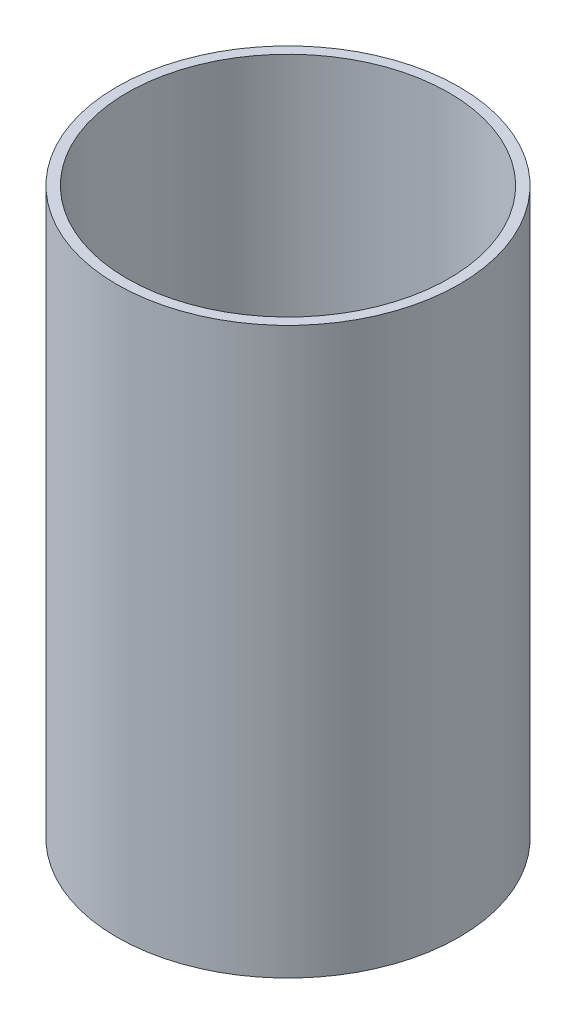
ISO-10303-21;
HEADER;
FILE_DESCRIPTION(('STEP AP214'),'2;1');
FILE_NAME('part.step','',(''),(''),'','','');
FILE_SCHEMA(('AUTOMOTIVE_DESIGN { 1 0 10303 214 1 1 1 1 }'));
ENDSEC;
DATA;
#1=APPLICATION_CONTEXT('core data for automotive mechanical design processes');
#2=APPLICATION_PROTOCOL_DEFINITION('international standard','automotive_design',2000,#1);
#3=PRODUCT_CONTEXT('',#1,'mechanical');
#4=PRODUCT('Part','Part','',(#3));
#5=PRODUCT_RELATED_PRODUCT_CATEGORY('part','',(#4));
#6=PRODUCT_DEFINITION_FORMATION('','',#4);
#7=PRODUCT_DEFINITION_CONTEXT('part definition',#1,'design');
#8=PRODUCT_DEFINITION('design','',#6,#7);
#9=PRODUCT_DEFINITION_SHAPE('','',#8);
#10=(LENGTH_UNIT() NAMED_UNIT(*) SI_UNIT(.MILLI.,.METRE.));
#11=(NAMED_UNIT(*) PLANE_ANGLE_UNIT() SI_UNIT($,.RADIAN.));
#12=(NAMED_UNIT(*) SI_UNIT($,.STERADIAN.) SOLID_ANGLE_UNIT());
#13=UNCERTAINTY_MEASURE_WITH_UNIT(LENGTH_MEASURE(1.E-05),#10,'distance_accuracy_value','');
#14=(GEOMETRIC_REPRESENTATION_CONTEXT(3) GLOBAL_UNCERTAINTY_ASSIGNED_CONTEXT((#13)) GLOBAL_UNIT_ASSIGNED_CONTEXT((#10,
#11,#12)) REPRESENTATION_CONTEXT('',''));
#15=CARTESIAN_POINT('',(0.,0.,0.));
#16=DIRECTION('',(0.,0.,1.));
#17=DIRECTION('',(1.,0.,0.));
#18=AXIS2_PLACEMENT_3D('',#15,#16,#17);
#19=CARTESIAN_POINT('',(0.,83.14,0.));
#20=DIRECTION('',(0.,1.,0.));
#21=DIRECTION('',(0.,0.,1.));
#22=AXIS2_PLACEMENT_3D('',#19,#20,#21);
#23=PLANE('',#22);
#24=CARTESIAN_POINT('',(0.,83.14,0.));
#25=DIRECTION('',(0.,1.,0.));
#26=DIRECTION('',(0.,0.,1.));
#27=AXIS2_PLACEMENT_3D('',#24,#25,#26);
#28=CIRCLE('',#27,25.175);
#29=CARTESIAN_POINT('',(0.,83.14,25.175));
#30=VERTEX_POINT('',#29);
#31=EDGE_CURVE('E10',#30,#30,#28,.T.);
#32=ORIENTED_EDGE('',*,*,#31,.T.);
#33=EDGE_LOOP('',(#32));
#34=FACE_BOUND('',#33,.T.);
#35=CARTESIAN_POINT('',(0.,83.14,0.));
#36=DIRECTION('',(0.,1.,0.));
#37=DIRECTION('',(0.,0.,1.));
#38=AXIS2_PLACEMENT_3D('',#35,#36,#37);
#39=CIRCLE('',#38,23.675);
#40=CARTESIAN_POINT('',(0.,83.14,23.675));
#41=VERTEX_POINT('',#40);
#42=EDGE_CURVE('E45',#41,#41,#39,.T.);
#43=ORIENTED_EDGE('',*,*,#42,.F.);
#44=EDGE_LOOP('',(#43));
#45=FACE_BOUND('',#44,.T.);
#46=ADVANCED_FACE('F34',(#34,#45),#23,.T.);
#47=CARTESIAN_POINT('',(0.,0.,0.));
#48=DIRECTION('',(0.,1.,0.));
#49=DIRECTION('',(0.,0.,1.));
#50=AXIS2_PLACEMENT_3D('',#47,#48,#49);
#51=PLANE('',#50);
#52=CARTESIAN_POINT('',(0.,0.,0.));
#53=DIRECTION('',(0.,1.,0.));
#54=DIRECTION('',(0.,0.,1.));
#55=AXIS2_PLACEMENT_3D('',#52,#53,#54);
#56=CIRCLE('',#55,25.175);
#57=CARTESIAN_POINT('',(0.,0.,25.175));
#58=VERTEX_POINT('',#57);
#59=EDGE_CURVE('E38',#58,#58,#56,.T.);
#60=ORIENTED_EDGE('',*,*,#59,.F.);
#61=EDGE_LOOP('',(#60));
#62=FACE_BOUND('',#61,.T.);
#63=CARTESIAN_POINT('',(0.,0.,0.));
#64=DIRECTION('',(0.,1.,0.));
#65=DIRECTION('',(0.,0.,1.));
#66=AXIS2_PLACEMENT_3D('',#63,#64,#65);
#67=CIRCLE('',#66,23.675);
#68=CARTESIAN_POINT('',(0.,0.,23.675));
#69=VERTEX_POINT('',#68);
#70=EDGE_CURVE('E47',#69,#69,#67,.T.);
#71=ORIENTED_EDGE('',*,*,#70,.T.);
#72=EDGE_LOOP('',(#71));
#73=FACE_BOUND('',#72,.T.);
#74=ADVANCED_FACE('F57',(#62,#73),#51,.F.);
#75=CARTESIAN_POINT('',(0.,83.14,0.));
#76=DIRECTION('',(0.,-1.,0.));
#77=DIRECTION('',(0.,0.,-1.));
#78=AXIS2_PLACEMENT_3D('',#75,#76,#77);
#79=CYLINDRICAL_SURFACE('',#78,25.175);
#80=ORIENTED_EDGE('',*,*,#31,.F.);
#81=EDGE_LOOP('',(#80));
#82=FACE_BOUND('',#81,.T.);
#83=ORIENTED_EDGE('',*,*,#59,.T.);
#84=EDGE_LOOP('',(#83));
#85=FACE_BOUND('',#84,.T.);
#86=ADVANCED_FACE('F36',(#82,#85),#79,.T.);
#87=CARTESIAN_POINT('',(0.,83.14,0.));
#88=DIRECTION('',(0.,-1.,0.));
#89=DIRECTION('',(0.,0.,-1.));
#90=AXIS2_PLACEMENT_3D('',#87,#88,#89);
#91=CYLINDRICAL_SURFACE('',#90,23.675);
#92=ORIENTED_EDGE('',*,*,#42,.T.);
#93=EDGE_LOOP('',(#92));
#94=FACE_BOUND('',#93,.T.);
#95=ORIENTED_EDGE('',*,*,#70,.F.);
#96=EDGE_LOOP('',(#95));
#97=FACE_BOUND('',#96,.T.);
#98=ADVANCED_FACE('F53',(#94,#97),#91,.F.);
#99=CLOSED_SHELL('',(#46,#74,#86,#98));
#100=MANIFOLD_SOLID_BREP('B2',#99);
#101=ADVANCED_BREP_SHAPE_REPRESENTATION('',(#18,#100),#14);
#102=SHAPE_DEFINITION_REPRESENTATION(#9,#101);
ENDSEC;
END-ISO-10303-21;
